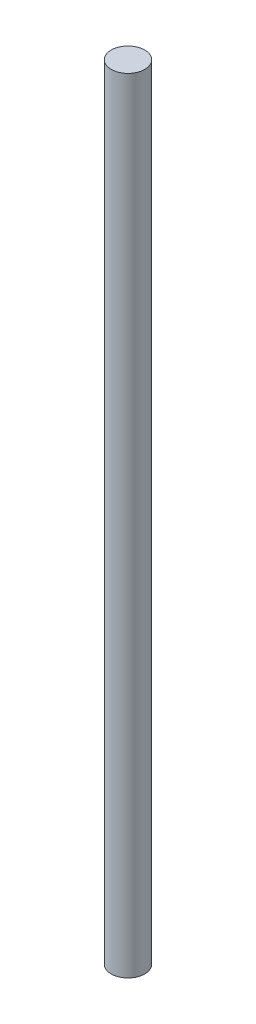
ISO-10303-21;
HEADER;
FILE_DESCRIPTION(('STEP AP214'),'2;1');
FILE_NAME('part.step','',(''),(''),'','','');
FILE_SCHEMA(('AUTOMOTIVE_DESIGN { 1 0 10303 214 1 1 1 1 }'));
ENDSEC;
DATA;
#1=APPLICATION_CONTEXT('core data for automotive mechanical design processes');
#2=APPLICATION_PROTOCOL_DEFINITION('international standard','automotive_design',2000,#1);
#3=PRODUCT_CONTEXT('',#1,'mechanical');
#4=PRODUCT('Part','Part','',(#3));
#5=PRODUCT_RELATED_PRODUCT_CATEGORY('part','',(#4));
#6=PRODUCT_DEFINITION_FORMATION('','',#4);
#7=PRODUCT_DEFINITION_CONTEXT('part definition',#1,'design');
#8=PRODUCT_DEFINITION('design','',#6,#7);
#9=PRODUCT_DEFINITION_SHAPE('','',#8);
#10=(LENGTH_UNIT() NAMED_UNIT(*) SI_UNIT(.MILLI.,.METRE.));
#11=(NAMED_UNIT(*) PLANE_ANGLE_UNIT() SI_UNIT($,.RADIAN.));
#12=(NAMED_UNIT(*) SI_UNIT($,.STERADIAN.) SOLID_ANGLE_UNIT());
#13=UNCERTAINTY_MEASURE_WITH_UNIT(LENGTH_MEASURE(1.E-05),#10,'distance_accuracy_value','');
#14=(GEOMETRIC_REPRESENTATION_CONTEXT(3) GLOBAL_UNCERTAINTY_ASSIGNED_CONTEXT((#13)) GLOBAL_UNIT_ASSIGNED_CONTEXT((#10,
#11,#12)) REPRESENTATION_CONTEXT('',''));
#15=CARTESIAN_POINT('',(0.,0.,0.));
#16=DIRECTION('',(0.,0.,1.));
#17=DIRECTION('',(1.,0.,0.));
#18=AXIS2_PLACEMENT_3D('',#15,#16,#17);
#19=CARTESIAN_POINT('',(0.,70.,0.));
#20=DIRECTION('',(0.,-1.,0.));
#21=DIRECTION('',(0.,0.,-1.));
#22=AXIS2_PLACEMENT_3D('',#19,#20,#21);
#23=CYLINDRICAL_SURFACE('',#22,1.5);
#24=CARTESIAN_POINT('',(0.,70.,0.));
#25=DIRECTION('',(0.,1.,0.));
#26=DIRECTION('',(0.,0.,1.));
#27=AXIS2_PLACEMENT_3D('',#24,#25,#26);
#28=CIRCLE('',#27,1.5);
#29=CARTESIAN_POINT('',(0.,70.,1.5));
#30=VERTEX_POINT('',#29);
#31=EDGE_CURVE('E10',#30,#30,#28,.T.);
#32=ORIENTED_EDGE('',*,*,#31,.F.);
#33=EDGE_LOOP('',(#32));
#34=FACE_BOUND('',#33,.T.);
#35=CARTESIAN_POINT('',(0.,0.,0.));
#36=DIRECTION('',(0.,1.,0.));
#37=DIRECTION('',(0.,0.,1.));
#38=AXIS2_PLACEMENT_3D('',#35,#36,#37);
#39=CIRCLE('',#38,1.5);
#40=CARTESIAN_POINT('',(0.,0.,1.5));
#41=VERTEX_POINT('',#40);
#42=EDGE_CURVE('E46',#41,#41,#39,.T.);
#43=ORIENTED_EDGE('',*,*,#42,.T.);
#44=EDGE_LOOP('',(#43));
#45=FACE_BOUND('',#44,.T.);
#46=ADVANCED_FACE('F43',(#34,#45),#23,.T.);
#47=CARTESIAN_POINT('',(0.,70.,0.));
#48=DIRECTION('',(0.,1.,0.));
#49=DIRECTION('',(0.,0.,1.));
#50=AXIS2_PLACEMENT_3D('',#47,#48,#49);
#51=PLANE('',#50);
#52=ORIENTED_EDGE('',*,*,#31,.T.);
#53=EDGE_LOOP('',(#52));
#54=FACE_BOUND('',#53,.T.);
#55=ADVANCED_FACE('F60',(#54),#51,.T.);
#56=CARTESIAN_POINT('',(0.,0.,0.));
#57=DIRECTION('',(0.,1.,0.));
#58=DIRECTION('',(0.,0.,1.));
#59=AXIS2_PLACEMENT_3D('',#56,#57,#58);
#60=PLANE('',#59);
#61=ORIENTED_EDGE('',*,*,#42,.F.);
#62=EDGE_LOOP('',(#61));
#63=FACE_BOUND('',#62,.T.);
#64=ADVANCED_FACE('F58',(#63),#60,.F.);
#65=CLOSED_SHELL('',(#46,#55,#64));
#66=MANIFOLD_SOLID_BREP('B2',#65);
#67=ADVANCED_BREP_SHAPE_REPRESENTATION('',(#18,#66),#14);
#68=SHAPE_DEFINITION_REPRESENTATION(#9,#67);
ENDSEC;
END-ISO-10303-21;
